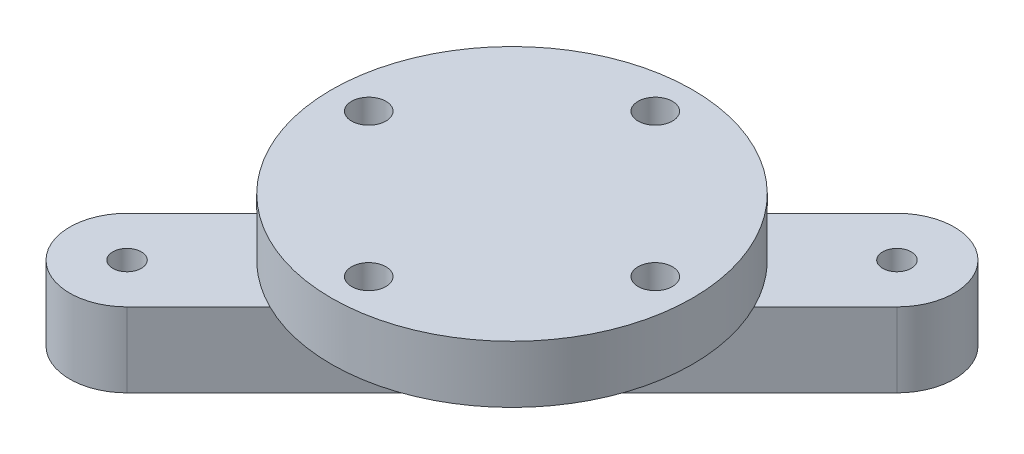
ISO-10303-21;
HEADER;
FILE_DESCRIPTION(('STEP AP214'),'2;1');
FILE_NAME('part.step','',(''),(''),'','','');
FILE_SCHEMA(('AUTOMOTIVE_DESIGN { 1 0 10303 214 1 1 1 1 }'));
ENDSEC;
DATA;
#1=APPLICATION_CONTEXT('core data for automotive mechanical design processes');
#2=APPLICATION_PROTOCOL_DEFINITION('international standard','automotive_design',2000,#1);
#3=PRODUCT_CONTEXT('',#1,'mechanical');
#4=PRODUCT('Part','Part','',(#3));
#5=PRODUCT_RELATED_PRODUCT_CATEGORY('part','',(#4));
#6=PRODUCT_DEFINITION_FORMATION('','',#4);
#7=PRODUCT_DEFINITION_CONTEXT('part definition',#1,'design');
#8=PRODUCT_DEFINITION('design','',#6,#7);
#9=PRODUCT_DEFINITION_SHAPE('','',#8);
#10=(LENGTH_UNIT() NAMED_UNIT(*) SI_UNIT(.MILLI.,.METRE.));
#11=(NAMED_UNIT(*) PLANE_ANGLE_UNIT() SI_UNIT($,.RADIAN.));
#12=(NAMED_UNIT(*) SI_UNIT($,.STERADIAN.) SOLID_ANGLE_UNIT());
#13=UNCERTAINTY_MEASURE_WITH_UNIT(LENGTH_MEASURE(1.E-05),#10,'distance_accuracy_value','');
#14=(GEOMETRIC_REPRESENTATION_CONTEXT(3) GLOBAL_UNCERTAINTY_ASSIGNED_CONTEXT((#13)) GLOBAL_UNIT_ASSIGNED_CONTEXT((#10,
#11,#12)) REPRESENTATION_CONTEXT('',''));
#15=CARTESIAN_POINT('',(0.,0.,0.));
#16=DIRECTION('',(0.,0.,1.));
#17=DIRECTION('',(1.,0.,0.));
#18=AXIS2_PLACEMENT_3D('',#15,#16,#17);
#19=CARTESIAN_POINT('',(0.,0.,0.));
#20=DIRECTION('',(0.,1.,0.));
#21=DIRECTION('',(0.,0.,1.));
#22=AXIS2_PLACEMENT_3D('',#19,#20,#21);
#23=PLANE('',#22);
#24=CARTESIAN_POINT('',(0.,0.,25.));
#25=DIRECTION('',(0.,1.,0.));
#26=DIRECTION('',(0.,0.,1.));
#27=AXIS2_PLACEMENT_3D('',#24,#25,#26);
#28=CIRCLE('',#27,5.);
#29=CARTESIAN_POINT('',(0.,0.,30.));
#30=VERTEX_POINT('',#29);
#31=EDGE_CURVE('E176',#30,#30,#28,.T.);
#32=ORIENTED_EDGE('',*,*,#31,.T.);
#33=EDGE_LOOP('',(#32));
#34=FACE_BOUND('',#33,.T.);
#35=CARTESIAN_POINT('',(25.,0.,0.));
#36=DIRECTION('',(0.,1.,0.));
#37=DIRECTION('',(0.,0.,1.));
#38=AXIS2_PLACEMENT_3D('',#35,#36,#37);
#39=CIRCLE('',#38,5.);
#40=CARTESIAN_POINT('',(25.,0.,5.));
#41=VERTEX_POINT('',#40);
#42=EDGE_CURVE('E168',#41,#41,#39,.T.);
#43=ORIENTED_EDGE('',*,*,#42,.T.);
#44=EDGE_LOOP('',(#43));
#45=FACE_BOUND('',#44,.T.);
#46=CARTESIAN_POINT('',(0.,0.,0.));
#47=DIRECTION('',(0.,1.,0.));
#48=DIRECTION('',(0.,0.,1.));
#49=AXIS2_PLACEMENT_3D('',#46,#47,#48);
#50=CIRCLE('',#49,31.5);
#51=CARTESIAN_POINT('',(-14.0506035235189,0.,28.1927391472499));
#52=VERTEX_POINT('',#51);
#53=CARTESIAN_POINT('',(28.1927391472499,0.,-14.050603523519));
#54=VERTEX_POINT('',#53);
#55=EDGE_CURVE('E195',#52,#54,#50,.T.);
#56=ORIENTED_EDGE('',*,*,#55,.F.);
#57=DIRECTION('',(0.707106781186547,0.,-0.707106781186548));
#58=VECTOR('',#57,1.);
#59=CARTESIAN_POINT('',(-26.5165042944955,0.,40.6586399182265));
#60=LINE('',#59,#58);
#61=EDGE_CURVE('E11',#52,#54,#60,.T.);
#62=ORIENTED_EDGE('',*,*,#61,.T.);
#63=EDGE_LOOP('',(#56,#62));
#64=FACE_BOUND('',#63,.T.);
#65=ADVANCED_FACE('F45',(#34,#45,#64),#23,.F.);
#66=CARTESIAN_POINT('',(0.,10.,0.));
#67=DIRECTION('',(0.,-1.,0.));
#68=DIRECTION('',(0.,0.,-1.));
#69=AXIS2_PLACEMENT_3D('',#66,#67,#68);
#70=CYLINDRICAL_SURFACE('',#69,31.5);
#71=CARTESIAN_POINT('',(0.,10.,0.));
#72=DIRECTION('',(0.,1.,0.));
#73=DIRECTION('',(0.,0.,1.));
#74=AXIS2_PLACEMENT_3D('',#71,#72,#73);
#75=CIRCLE('',#74,31.5);
#76=CARTESIAN_POINT('',(0.,10.,31.5));
#77=VERTEX_POINT('',#76);
#78=EDGE_CURVE('E208',#77,#77,#75,.T.);
#79=ORIENTED_EDGE('',*,*,#78,.F.);
#80=EDGE_LOOP('',(#79));
#81=FACE_BOUND('',#80,.T.);
#82=CARTESIAN_POINT('',(14.0506035235189,0.,-28.1927391472499));
#83=VERTEX_POINT('',#82);
#84=EDGE_CURVE('E212',#54,#83,#50,.T.);
#85=ORIENTED_EDGE('',*,*,#84,.T.);
#86=CARTESIAN_POINT('',(-28.1927391472499,0.,14.0506035235189));
#87=VERTEX_POINT('',#86);
#88=EDGE_CURVE('E216',#83,#87,#50,.T.);
#89=ORIENTED_EDGE('',*,*,#88,.T.);
#90=EDGE_CURVE('E264',#87,#52,#50,.T.);
#91=ORIENTED_EDGE('',*,*,#90,.T.);
#92=ORIENTED_EDGE('',*,*,#55,.T.);
#93=EDGE_LOOP('',(#85,#89,#91,#92));
#94=FACE_BOUND('',#93,.T.);
#95=ADVANCED_FACE('F47',(#81,#94),#70,.T.);
#96=CARTESIAN_POINT('',(0.,10.,0.));
#97=DIRECTION('',(0.,1.,0.));
#98=DIRECTION('',(0.,0.,1.));
#99=AXIS2_PLACEMENT_3D('',#96,#97,#98);
#100=PLANE('',#99);
#101=CARTESIAN_POINT('',(0.,10.,-25.));
#102=DIRECTION('',(0.,1.,0.));
#103=DIRECTION('',(0.,0.,1.));
#104=AXIS2_PLACEMENT_3D('',#101,#102,#103);
#105=CIRCLE('',#104,3.);
#106=CARTESIAN_POINT('',(0.,10.,-22.));
#107=VERTEX_POINT('',#106);
#108=EDGE_CURVE('E191',#107,#107,#105,.T.);
#109=ORIENTED_EDGE('',*,*,#108,.F.);
#110=EDGE_LOOP('',(#109));
#111=FACE_BOUND('',#110,.T.);
#112=CARTESIAN_POINT('',(25.,10.,0.));
#113=DIRECTION('',(0.,1.,0.));
#114=DIRECTION('',(0.,0.,1.));
#115=AXIS2_PLACEMENT_3D('',#112,#113,#114);
#116=CIRCLE('',#115,3.);
#117=CARTESIAN_POINT('',(25.,10.,3.));
#118=VERTEX_POINT('',#117);
#119=EDGE_CURVE('E196',#118,#118,#116,.T.);
#120=ORIENTED_EDGE('',*,*,#119,.F.);
#121=EDGE_LOOP('',(#120));
#122=FACE_BOUND('',#121,.T.);
#123=CARTESIAN_POINT('',(0.,10.,25.));
#124=DIRECTION('',(0.,1.,0.));
#125=DIRECTION('',(0.,0.,1.));
#126=AXIS2_PLACEMENT_3D('',#123,#124,#125);
#127=CIRCLE('',#126,3.);
#128=CARTESIAN_POINT('',(0.,10.,28.));
#129=VERTEX_POINT('',#128);
#130=EDGE_CURVE('E200',#129,#129,#127,.T.);
#131=ORIENTED_EDGE('',*,*,#130,.F.);
#132=EDGE_LOOP('',(#131));
#133=FACE_BOUND('',#132,.T.);
#134=CARTESIAN_POINT('',(-25.,10.,0.));
#135=DIRECTION('',(0.,1.,0.));
#136=DIRECTION('',(0.,0.,1.));
#137=AXIS2_PLACEMENT_3D('',#134,#135,#136);
#138=CIRCLE('',#137,3.);
#139=CARTESIAN_POINT('',(-25.,10.,3.00000000000001));
#140=VERTEX_POINT('',#139);
#141=EDGE_CURVE('E204',#140,#140,#138,.T.);
#142=ORIENTED_EDGE('',*,*,#141,.F.);
#143=EDGE_LOOP('',(#142));
#144=FACE_BOUND('',#143,.T.);
#145=ORIENTED_EDGE('',*,*,#78,.T.);
#146=EDGE_LOOP('',(#145));
#147=FACE_BOUND('',#146,.T.);
#148=ADVANCED_FACE('F243',(#111,#122,#133,#144,#147),#100,.T.);
#149=CARTESIAN_POINT('',(0.,0.,-25.));
#150=DIRECTION('',(0.,1.,0.));
#151=DIRECTION('',(0.,0.,1.));
#152=AXIS2_PLACEMENT_3D('',#149,#150,#151);
#153=CIRCLE('',#152,5.);
#154=CARTESIAN_POINT('',(0.,0.,-20.));
#155=VERTEX_POINT('',#154);
#156=EDGE_CURVE('E164',#155,#155,#153,.T.);
#157=ORIENTED_EDGE('',*,*,#156,.T.);
#158=EDGE_LOOP('',(#157));
#159=FACE_BOUND('',#158,.T.);
#160=CARTESIAN_POINT('',(-25.,0.,0.));
#161=DIRECTION('',(0.,1.,0.));
#162=DIRECTION('',(0.,0.,1.));
#163=AXIS2_PLACEMENT_3D('',#160,#161,#162);
#164=CIRCLE('',#163,5.);
#165=CARTESIAN_POINT('',(-25.,0.,5.00000000000001));
#166=VERTEX_POINT('',#165);
#167=EDGE_CURVE('E184',#166,#166,#164,.T.);
#168=ORIENTED_EDGE('',*,*,#167,.T.);
#169=EDGE_LOOP('',(#168));
#170=FACE_BOUND('',#169,.T.);
#171=ORIENTED_EDGE('',*,*,#88,.F.);
#172=DIRECTION('',(-0.707106781186547,0.,0.707106781186548));
#173=VECTOR('',#172,1.);
#174=CARTESIAN_POINT('',(-40.6586399182265,0.,26.5165042944955));
#175=LINE('',#174,#173);
#176=EDGE_CURVE('E55',#83,#87,#175,.T.);
#177=ORIENTED_EDGE('',*,*,#176,.T.);
#178=EDGE_LOOP('',(#171,#177));
#179=FACE_BOUND('',#178,.T.);
#180=ADVANCED_FACE('F239',(#159,#170,#179),#23,.F.);
#181=CARTESIAN_POINT('',(-25.,10.,0.));
#182=DIRECTION('',(0.,-1.,0.));
#183=DIRECTION('',(0.,0.,-1.));
#184=AXIS2_PLACEMENT_3D('',#181,#182,#183);
#185=CYLINDRICAL_SURFACE('',#184,3.);
#186=CARTESIAN_POINT('',(-25.,5.,0.));
#187=DIRECTION('',(0.,1.,0.));
#188=DIRECTION('',(0.,0.,1.));
#189=AXIS2_PLACEMENT_3D('',#186,#187,#188);
#190=CIRCLE('',#189,3.);
#191=CARTESIAN_POINT('',(-25.,5.,3.00000000000001));
#192=VERTEX_POINT('',#191);
#193=EDGE_CURVE('E49',#192,#192,#190,.T.);
#194=ORIENTED_EDGE('',*,*,#193,.F.);
#195=EDGE_LOOP('',(#194));
#196=FACE_BOUND('',#195,.T.);
#197=ORIENTED_EDGE('',*,*,#141,.T.);
#198=EDGE_LOOP('',(#197));
#199=FACE_BOUND('',#198,.T.);
#200=ADVANCED_FACE('F235',(#196,#199),#185,.F.);
#201=CARTESIAN_POINT('',(0.,10.,25.));
#202=DIRECTION('',(0.,-1.,0.));
#203=DIRECTION('',(0.,0.,-1.));
#204=AXIS2_PLACEMENT_3D('',#201,#202,#203);
#205=CYLINDRICAL_SURFACE('',#204,3.);
#206=CARTESIAN_POINT('',(0.,5.,25.));
#207=DIRECTION('',(0.,1.,0.));
#208=DIRECTION('',(0.,0.,1.));
#209=AXIS2_PLACEMENT_3D('',#206,#207,#208);
#210=CIRCLE('',#209,3.);
#211=CARTESIAN_POINT('',(0.,5.,28.));
#212=VERTEX_POINT('',#211);
#213=EDGE_CURVE('E223',#212,#212,#210,.T.);
#214=ORIENTED_EDGE('',*,*,#213,.F.);
#215=EDGE_LOOP('',(#214));
#216=FACE_BOUND('',#215,.T.);
#217=ORIENTED_EDGE('',*,*,#130,.T.);
#218=EDGE_LOOP('',(#217));
#219=FACE_BOUND('',#218,.T.);
#220=ADVANCED_FACE('F238',(#216,#219),#205,.F.);
#221=CARTESIAN_POINT('',(25.,10.,0.));
#222=DIRECTION('',(0.,-1.,0.));
#223=DIRECTION('',(0.,0.,-1.));
#224=AXIS2_PLACEMENT_3D('',#221,#222,#223);
#225=CYLINDRICAL_SURFACE('',#224,3.);
#226=CARTESIAN_POINT('',(25.,5.,0.));
#227=DIRECTION('',(0.,1.,0.));
#228=DIRECTION('',(0.,0.,1.));
#229=AXIS2_PLACEMENT_3D('',#226,#227,#228);
#230=CIRCLE('',#229,3.);
#231=CARTESIAN_POINT('',(25.,5.,3.));
#232=VERTEX_POINT('',#231);
#233=EDGE_CURVE('E220',#232,#232,#230,.T.);
#234=ORIENTED_EDGE('',*,*,#233,.F.);
#235=EDGE_LOOP('',(#234));
#236=FACE_BOUND('',#235,.T.);
#237=ORIENTED_EDGE('',*,*,#119,.T.);
#238=EDGE_LOOP('',(#237));
#239=FACE_BOUND('',#238,.T.);
#240=ADVANCED_FACE('F315',(#236,#239),#225,.F.);
#241=CARTESIAN_POINT('',(0.,10.,-25.));
#242=DIRECTION('',(0.,-1.,0.));
#243=DIRECTION('',(0.,0.,-1.));
#244=AXIS2_PLACEMENT_3D('',#241,#242,#243);
#245=CYLINDRICAL_SURFACE('',#244,3.);
#246=CARTESIAN_POINT('',(0.,5.,-25.));
#247=DIRECTION('',(0.,1.,0.));
#248=DIRECTION('',(0.,0.,1.));
#249=AXIS2_PLACEMENT_3D('',#246,#247,#248);
#250=CIRCLE('',#249,3.);
#251=CARTESIAN_POINT('',(0.,5.,-22.));
#252=VERTEX_POINT('',#251);
#253=EDGE_CURVE('E163',#252,#252,#250,.T.);
#254=ORIENTED_EDGE('',*,*,#253,.F.);
#255=EDGE_LOOP('',(#254));
#256=FACE_BOUND('',#255,.T.);
#257=ORIENTED_EDGE('',*,*,#108,.T.);
#258=EDGE_LOOP('',(#257));
#259=FACE_BOUND('',#258,.T.);
#260=ADVANCED_FACE('F311',(#256,#259),#245,.F.);
#261=CARTESIAN_POINT('',(0.,5.,-25.));
#262=DIRECTION('',(0.,-1.,0.));
#263=DIRECTION('',(0.,0.,-1.));
#264=AXIS2_PLACEMENT_3D('',#261,#262,#263);
#265=CYLINDRICAL_SURFACE('',#264,5.);
#266=CARTESIAN_POINT('',(0.,5.,-25.));
#267=DIRECTION('',(0.,1.,0.));
#268=DIRECTION('',(0.,0.,1.));
#269=AXIS2_PLACEMENT_3D('',#266,#267,#268);
#270=CIRCLE('',#269,5.);
#271=CARTESIAN_POINT('',(0.,5.,-20.));
#272=VERTEX_POINT('',#271);
#273=EDGE_CURVE('E159',#272,#272,#270,.T.);
#274=ORIENTED_EDGE('',*,*,#273,.T.);
#275=EDGE_LOOP('',(#274));
#276=FACE_BOUND('',#275,.T.);
#277=ORIENTED_EDGE('',*,*,#156,.F.);
#278=EDGE_LOOP('',(#277));
#279=FACE_BOUND('',#278,.T.);
#280=ADVANCED_FACE('F314',(#276,#279),#265,.F.);
#281=CARTESIAN_POINT('',(0.,5.,-25.));
#282=DIRECTION('',(0.,1.,0.));
#283=DIRECTION('',(0.,0.,1.));
#284=AXIS2_PLACEMENT_3D('',#281,#282,#283);
#285=PLANE('',#284);
#286=ORIENTED_EDGE('',*,*,#253,.T.);
#287=EDGE_LOOP('',(#286));
#288=FACE_BOUND('',#287,.T.);
#289=ORIENTED_EDGE('',*,*,#273,.F.);
#290=EDGE_LOOP('',(#289));
#291=FACE_BOUND('',#290,.T.);
#292=ADVANCED_FACE('F346',(#288,#291),#285,.F.);
#293=CARTESIAN_POINT('',(25.,5.,0.));
#294=DIRECTION('',(0.,-1.,0.));
#295=DIRECTION('',(0.,0.,-1.));
#296=AXIS2_PLACEMENT_3D('',#293,#294,#295);
#297=CYLINDRICAL_SURFACE('',#296,5.);
#298=CARTESIAN_POINT('',(25.,5.,0.));
#299=DIRECTION('',(0.,1.,0.));
#300=DIRECTION('',(0.,0.,1.));
#301=AXIS2_PLACEMENT_3D('',#298,#299,#300);
#302=CIRCLE('',#301,5.);
#303=CARTESIAN_POINT('',(25.,5.,5.));
#304=VERTEX_POINT('',#303);
#305=EDGE_CURVE('E172',#304,#304,#302,.T.);
#306=ORIENTED_EDGE('',*,*,#305,.T.);
#307=EDGE_LOOP('',(#306));
#308=FACE_BOUND('',#307,.T.);
#309=ORIENTED_EDGE('',*,*,#42,.F.);
#310=EDGE_LOOP('',(#309));
#311=FACE_BOUND('',#310,.T.);
#312=ADVANCED_FACE('F355',(#308,#311),#297,.F.);
#313=CARTESIAN_POINT('',(25.,5.,0.));
#314=DIRECTION('',(0.,1.,0.));
#315=DIRECTION('',(0.,0.,1.));
#316=AXIS2_PLACEMENT_3D('',#313,#314,#315);
#317=PLANE('',#316);
#318=ORIENTED_EDGE('',*,*,#233,.T.);
#319=EDGE_LOOP('',(#318));
#320=FACE_BOUND('',#319,.T.);
#321=ORIENTED_EDGE('',*,*,#305,.F.);
#322=EDGE_LOOP('',(#321));
#323=FACE_BOUND('',#322,.T.);
#324=ADVANCED_FACE('F364',(#320,#323),#317,.F.);
#325=CARTESIAN_POINT('',(0.,5.,25.));
#326=DIRECTION('',(0.,-1.,0.));
#327=DIRECTION('',(0.,0.,-1.));
#328=AXIS2_PLACEMENT_3D('',#325,#326,#327);
#329=CYLINDRICAL_SURFACE('',#328,5.);
#330=CARTESIAN_POINT('',(0.,5.,25.));
#331=DIRECTION('',(0.,1.,0.));
#332=DIRECTION('',(0.,0.,1.));
#333=AXIS2_PLACEMENT_3D('',#330,#331,#332);
#334=CIRCLE('',#333,5.);
#335=CARTESIAN_POINT('',(0.,5.,30.));
#336=VERTEX_POINT('',#335);
#337=EDGE_CURVE('E180',#336,#336,#334,.T.);
#338=ORIENTED_EDGE('',*,*,#337,.T.);
#339=EDGE_LOOP('',(#338));
#340=FACE_BOUND('',#339,.T.);
#341=ORIENTED_EDGE('',*,*,#31,.F.);
#342=EDGE_LOOP('',(#341));
#343=FACE_BOUND('',#342,.T.);
#344=ADVANCED_FACE('F307',(#340,#343),#329,.F.);
#345=CARTESIAN_POINT('',(0.,5.,25.));
#346=DIRECTION('',(0.,1.,0.));
#347=DIRECTION('',(0.,0.,1.));
#348=AXIS2_PLACEMENT_3D('',#345,#346,#347);
#349=PLANE('',#348);
#350=ORIENTED_EDGE('',*,*,#213,.T.);
#351=EDGE_LOOP('',(#350));
#352=FACE_BOUND('',#351,.T.);
#353=ORIENTED_EDGE('',*,*,#337,.F.);
#354=EDGE_LOOP('',(#353));
#355=FACE_BOUND('',#354,.T.);
#356=ADVANCED_FACE('F300',(#352,#355),#349,.F.);
#357=CARTESIAN_POINT('',(-25.,5.,0.));
#358=DIRECTION('',(0.,-1.,0.));
#359=DIRECTION('',(0.,0.,-1.));
#360=AXIS2_PLACEMENT_3D('',#357,#358,#359);
#361=CYLINDRICAL_SURFACE('',#360,5.);
#362=CARTESIAN_POINT('',(-25.,5.,0.));
#363=DIRECTION('',(0.,1.,0.));
#364=DIRECTION('',(0.,0.,1.));
#365=AXIS2_PLACEMENT_3D('',#362,#363,#364);
#366=CIRCLE('',#365,5.);
#367=CARTESIAN_POINT('',(-25.,5.,5.00000000000001));
#368=VERTEX_POINT('',#367);
#369=EDGE_CURVE('E153',#368,#368,#366,.T.);
#370=ORIENTED_EDGE('',*,*,#369,.T.);
#371=EDGE_LOOP('',(#370));
#372=FACE_BOUND('',#371,.T.);
#373=ORIENTED_EDGE('',*,*,#167,.F.);
#374=EDGE_LOOP('',(#373));
#375=FACE_BOUND('',#374,.T.);
#376=ADVANCED_FACE('F298',(#372,#375),#361,.F.);
#377=CARTESIAN_POINT('',(-25.,5.,0.));
#378=DIRECTION('',(0.,1.,0.));
#379=DIRECTION('',(0.,0.,1.));
#380=AXIS2_PLACEMENT_3D('',#377,#378,#379);
#381=PLANE('',#380);
#382=ORIENTED_EDGE('',*,*,#193,.T.);
#383=EDGE_LOOP('',(#382));
#384=FACE_BOUND('',#383,.T.);
#385=ORIENTED_EDGE('',*,*,#369,.F.);
#386=EDGE_LOOP('',(#385));
#387=FACE_BOUND('',#386,.T.);
#388=ADVANCED_FACE('F232',(#384,#387),#381,.F.);
#389=CARTESIAN_POINT('',(-33.587572106361,0.,33.587572106361));
#390=DIRECTION('',(0.,1.,0.));
#391=DIRECTION('',(0.,0.,1.));
#392=AXIS2_PLACEMENT_3D('',#389,#390,#391);
#393=PLANE('',#392);
#394=CARTESIAN_POINT('',(33.587572106361,0.,-33.587572106361));
#395=DIRECTION('',(0.,1.,0.));
#396=DIRECTION('',(0.,0.,1.));
#397=AXIS2_PLACEMENT_3D('',#394,#395,#396);
#398=CIRCLE('',#397,2.5);
#399=CARTESIAN_POINT('',(33.587572106361,0.,-31.087572106361));
#400=VERTEX_POINT('',#399);
#401=EDGE_CURVE('E135',#400,#400,#398,.T.);
#402=ORIENTED_EDGE('',*,*,#401,.F.);
#403=EDGE_LOOP('',(#402));
#404=FACE_BOUND('',#403,.T.);
#405=ORIENTED_EDGE('',*,*,#84,.F.);
#406=CARTESIAN_POINT('',(40.6586399182265,0.,-26.5165042944955));
#407=VERTEX_POINT('',#406);
#408=EDGE_CURVE('E58',#54,#407,#60,.T.);
#409=ORIENTED_EDGE('',*,*,#408,.T.);
#410=CARTESIAN_POINT('',(33.587572106361,0.,-33.587572106361));
#411=DIRECTION('',(0.,1.,0.));
#412=DIRECTION('',(0.,0.,1.));
#413=AXIS2_PLACEMENT_3D('',#410,#411,#412);
#414=CIRCLE('',#413,10.);
#415=CARTESIAN_POINT('',(26.5165042944955,0.,-40.6586399182265));
#416=VERTEX_POINT('',#415);
#417=EDGE_CURVE('E147',#407,#416,#414,.T.);
#418=ORIENTED_EDGE('',*,*,#417,.T.);
#419=EDGE_CURVE('E130',#416,#83,#175,.T.);
#420=ORIENTED_EDGE('',*,*,#419,.T.);
#421=EDGE_LOOP('',(#405,#409,#418,#420));
#422=FACE_BOUND('',#421,.T.);
#423=ADVANCED_FACE('F259',(#404,#422),#393,.T.);
#424=CARTESIAN_POINT('',(-33.587572106361,0.,33.587572106361));
#425=DIRECTION('',(0.,1.,0.));
#426=DIRECTION('',(0.,0.,1.));
#427=AXIS2_PLACEMENT_3D('',#424,#425,#426);
#428=CIRCLE('',#427,2.5);
#429=CARTESIAN_POINT('',(-33.587572106361,0.,36.087572106361));
#430=VERTEX_POINT('',#429);
#431=EDGE_CURVE('E479',#430,#430,#428,.T.);
#432=ORIENTED_EDGE('',*,*,#431,.F.);
#433=EDGE_LOOP('',(#432));
#434=FACE_BOUND('',#433,.T.);
#435=ORIENTED_EDGE('',*,*,#90,.F.);
#436=CARTESIAN_POINT('',(-40.6586399182265,0.,26.5165042944955));
#437=VERTEX_POINT('',#436);
#438=EDGE_CURVE('E65',#87,#437,#175,.T.);
#439=ORIENTED_EDGE('',*,*,#438,.T.);
#440=CARTESIAN_POINT('',(-33.587572106361,0.,33.587572106361));
#441=DIRECTION('',(0.,1.,0.));
#442=DIRECTION('',(0.,0.,1.));
#443=AXIS2_PLACEMENT_3D('',#440,#441,#442);
#444=CIRCLE('',#443,10.);
#445=CARTESIAN_POINT('',(-26.5165042944955,0.,40.6586399182265));
#446=VERTEX_POINT('',#445);
#447=EDGE_CURVE('E142',#437,#446,#444,.T.);
#448=ORIENTED_EDGE('',*,*,#447,.T.);
#449=EDGE_CURVE('E57',#446,#52,#60,.T.);
#450=ORIENTED_EDGE('',*,*,#449,.T.);
#451=EDGE_LOOP('',(#435,#439,#448,#450));
#452=FACE_BOUND('',#451,.T.);
#453=ADVANCED_FACE('F271',(#434,#452),#393,.T.);
#454=CARTESIAN_POINT('',(-33.587572106361,-13.,33.587572106361));
#455=DIRECTION('',(0.,1.,0.));
#456=DIRECTION('',(0.,0.,1.));
#457=AXIS2_PLACEMENT_3D('',#454,#455,#456);
#458=CYLINDRICAL_SURFACE('',#457,10.);
#459=ORIENTED_EDGE('',*,*,#447,.F.);
#460=DIRECTION('',(0.,1.,0.));
#461=VECTOR('',#460,1.);
#462=CARTESIAN_POINT('',(-40.6586399182265,-13.,26.5165042944955));
#463=LINE('',#462,#461);
#464=CARTESIAN_POINT('',(-40.6586399182265,-13.,26.5165042944955));
#465=VERTEX_POINT('',#464);
#466=EDGE_CURVE('E128',#465,#437,#463,.T.);
#467=ORIENTED_EDGE('',*,*,#466,.F.);
#468=CARTESIAN_POINT('',(-33.587572106361,-13.,33.587572106361));
#469=DIRECTION('',(0.,1.,0.));
#470=DIRECTION('',(0.,0.,1.));
#471=AXIS2_PLACEMENT_3D('',#468,#469,#470);
#472=CIRCLE('',#471,10.);
#473=CARTESIAN_POINT('',(-26.5165042944955,-13.,40.6586399182265));
#474=VERTEX_POINT('',#473);
#475=EDGE_CURVE('E121',#465,#474,#472,.T.);
#476=ORIENTED_EDGE('',*,*,#475,.T.);
#477=DIRECTION('',(0.,1.,0.));
#478=VECTOR('',#477,1.);
#479=CARTESIAN_POINT('',(-26.5165042944955,-13.,40.6586399182265));
#480=LINE('',#479,#478);
#481=EDGE_CURVE('E102',#474,#446,#480,.T.);
#482=ORIENTED_EDGE('',*,*,#481,.T.);
#483=EDGE_LOOP('',(#459,#467,#476,#482));
#484=FACE_BOUND('',#483,.T.);
#485=ADVANCED_FACE('F127',(#484),#458,.T.);
#486=CARTESIAN_POINT('',(-40.6586399182265,-13.,26.5165042944955));
#487=DIRECTION('',(-0.707106781186548,0.,-0.707106781186547));
#488=DIRECTION('',(-0.707106781186547,0.,0.707106781186548));
#489=AXIS2_PLACEMENT_3D('',#486,#487,#488);
#490=PLANE('',#489);
#491=ORIENTED_EDGE('',*,*,#419,.F.);
#492=DIRECTION('',(0.,1.,0.));
#493=VECTOR('',#492,1.);
#494=CARTESIAN_POINT('',(26.5165042944955,-13.,-40.6586399182265));
#495=LINE('',#494,#493);
#496=CARTESIAN_POINT('',(26.5165042944955,-13.,-40.6586399182265));
#497=VERTEX_POINT('',#496);
#498=EDGE_CURVE('E154',#497,#416,#495,.T.);
#499=ORIENTED_EDGE('',*,*,#498,.F.);
#500=DIRECTION('',(-0.707106781186547,0.,0.707106781186548));
#501=VECTOR('',#500,1.);
#502=CARTESIAN_POINT('',(-40.6586399182265,-13.,26.5165042944955));
#503=LINE('',#502,#501);
#504=EDGE_CURVE('E114',#497,#465,#503,.T.);
#505=ORIENTED_EDGE('',*,*,#504,.T.);
#506=ORIENTED_EDGE('',*,*,#466,.T.);
#507=ORIENTED_EDGE('',*,*,#438,.F.);
#508=ORIENTED_EDGE('',*,*,#176,.F.);
#509=EDGE_LOOP('',(#491,#499,#505,#506,#507,#508));
#510=FACE_BOUND('',#509,.T.);
#511=ADVANCED_FACE('F272',(#510),#490,.T.);
#512=CARTESIAN_POINT('',(33.587572106361,-13.,-33.587572106361));
#513=DIRECTION('',(0.,1.,0.));
#514=DIRECTION('',(0.,0.,1.));
#515=AXIS2_PLACEMENT_3D('',#512,#513,#514);
#516=CYLINDRICAL_SURFACE('',#515,10.);
#517=ORIENTED_EDGE('',*,*,#417,.F.);
#518=DIRECTION('',(0.,1.,0.));
#519=VECTOR('',#518,1.);
#520=CARTESIAN_POINT('',(40.6586399182265,-13.,-26.5165042944955));
#521=LINE('',#520,#519);
#522=CARTESIAN_POINT('',(40.6586399182265,-13.,-26.5165042944955));
#523=VERTEX_POINT('',#522);
#524=EDGE_CURVE('E113',#523,#407,#521,.T.);
#525=ORIENTED_EDGE('',*,*,#524,.F.);
#526=CARTESIAN_POINT('',(33.587572106361,-13.,-33.587572106361));
#527=DIRECTION('',(0.,1.,0.));
#528=DIRECTION('',(0.,0.,1.));
#529=AXIS2_PLACEMENT_3D('',#526,#527,#528);
#530=CIRCLE('',#529,10.);
#531=EDGE_CURVE('E124',#523,#497,#530,.T.);
#532=ORIENTED_EDGE('',*,*,#531,.T.);
#533=ORIENTED_EDGE('',*,*,#498,.T.);
#534=EDGE_LOOP('',(#517,#525,#532,#533));
#535=FACE_BOUND('',#534,.T.);
#536=ADVANCED_FACE('F274',(#535),#516,.T.);
#537=CARTESIAN_POINT('',(-26.5165042944955,-13.,40.6586399182265));
#538=DIRECTION('',(0.707106781186548,0.,0.707106781186547));
#539=DIRECTION('',(0.707106781186547,0.,-0.707106781186548));
#540=AXIS2_PLACEMENT_3D('',#537,#538,#539);
#541=PLANE('',#540);
#542=ORIENTED_EDGE('',*,*,#449,.F.);
#543=ORIENTED_EDGE('',*,*,#481,.F.);
#544=DIRECTION('',(0.707106781186547,0.,-0.707106781186548));
#545=VECTOR('',#544,1.);
#546=CARTESIAN_POINT('',(-26.5165042944955,-13.,40.6586399182265));
#547=LINE('',#546,#545);
#548=EDGE_CURVE('E106',#474,#523,#547,.T.);
#549=ORIENTED_EDGE('',*,*,#548,.T.);
#550=ORIENTED_EDGE('',*,*,#524,.T.);
#551=ORIENTED_EDGE('',*,*,#408,.F.);
#552=ORIENTED_EDGE('',*,*,#61,.F.);
#553=EDGE_LOOP('',(#542,#543,#549,#550,#551,#552));
#554=FACE_BOUND('',#553,.T.);
#555=ADVANCED_FACE('F104',(#554),#541,.T.);
#556=CARTESIAN_POINT('',(-33.587572106361,-13.,33.587572106361));
#557=DIRECTION('',(0.,1.,0.));
#558=DIRECTION('',(0.,0.,1.));
#559=AXIS2_PLACEMENT_3D('',#556,#557,#558);
#560=PLANE('',#559);
#561=CARTESIAN_POINT('',(-33.587572106361,-13.,33.587572106361));
#562=DIRECTION('',(0.,1.,0.));
#563=DIRECTION('',(0.,0.,1.));
#564=AXIS2_PLACEMENT_3D('',#561,#562,#563);
#565=CIRCLE('',#564,2.5);
#566=CARTESIAN_POINT('',(-33.587572106361,-13.,36.087572106361));
#567=VERTEX_POINT('',#566);
#568=EDGE_CURVE('E476',#567,#567,#565,.T.);
#569=ORIENTED_EDGE('',*,*,#568,.T.);
#570=EDGE_LOOP('',(#569));
#571=FACE_BOUND('',#570,.T.);
#572=CARTESIAN_POINT('',(33.587572106361,-13.,-33.587572106361));
#573=DIRECTION('',(0.,1.,0.));
#574=DIRECTION('',(0.,0.,1.));
#575=AXIS2_PLACEMENT_3D('',#572,#573,#574);
#576=CIRCLE('',#575,2.5);
#577=CARTESIAN_POINT('',(33.587572106361,-13.,-31.087572106361));
#578=VERTEX_POINT('',#577);
#579=EDGE_CURVE('E144',#578,#578,#576,.T.);
#580=ORIENTED_EDGE('',*,*,#579,.T.);
#581=EDGE_LOOP('',(#580));
#582=FACE_BOUND('',#581,.T.);
#583=ORIENTED_EDGE('',*,*,#475,.F.);
#584=ORIENTED_EDGE('',*,*,#504,.F.);
#585=ORIENTED_EDGE('',*,*,#531,.F.);
#586=ORIENTED_EDGE('',*,*,#548,.F.);
#587=EDGE_LOOP('',(#583,#584,#585,#586));
#588=FACE_BOUND('',#587,.T.);
#589=ADVANCED_FACE('F119',(#571,#582,#588),#560,.F.);
#590=CARTESIAN_POINT('',(33.587572106361,-13.,-33.587572106361));
#591=DIRECTION('',(0.,1.,0.));
#592=DIRECTION('',(0.,0.,1.));
#593=AXIS2_PLACEMENT_3D('',#590,#591,#592);
#594=CYLINDRICAL_SURFACE('',#593,2.5);
#595=CARTESIAN_POINT('',(33.587572106361,-13.,-31.087572106361));
#596=CARTESIAN_POINT('',(33.587572106361,-12.8645833333333,-31.087572106361));
#597=CARTESIAN_POINT('',(33.587572106361,-12.7291666666667,-31.087572106361));
#598=CARTESIAN_POINT('',(33.587572106361,-12.4583333333333,-31.087572106361));
#599=CARTESIAN_POINT('',(33.587572106361,-12.3229166666667,-31.087572106361));
#600=CARTESIAN_POINT('',(33.587572106361,-12.0520833333333,-31.087572106361));
#601=CARTESIAN_POINT('',(33.587572106361,-11.9166666666667,-31.087572106361));
#602=CARTESIAN_POINT('',(33.587572106361,-11.6458333333333,-31.087572106361));
#603=CARTESIAN_POINT('',(33.587572106361,-11.5104166666667,-31.087572106361));
#604=CARTESIAN_POINT('',(33.587572106361,-11.2395833333333,-31.087572106361));
#605=CARTESIAN_POINT('',(33.587572106361,-11.1041666666667,-31.087572106361));
#606=CARTESIAN_POINT('',(33.587572106361,-10.8333333333333,-31.087572106361));
#607=CARTESIAN_POINT('',(33.587572106361,-10.6979166666667,-31.087572106361));
#608=CARTESIAN_POINT('',(33.587572106361,-10.4270833333333,-31.087572106361));
#609=CARTESIAN_POINT('',(33.587572106361,-10.2916666666667,-31.087572106361));
#610=CARTESIAN_POINT('',(33.587572106361,-10.0208333333333,-31.087572106361));
#611=CARTESIAN_POINT('',(33.587572106361,-9.88541666666667,-31.087572106361));
#612=CARTESIAN_POINT('',(33.587572106361,-9.61458333333333,-31.087572106361));
#613=CARTESIAN_POINT('',(33.587572106361,-9.47916666666667,-31.087572106361));
#614=CARTESIAN_POINT('',(33.587572106361,-9.20833333333333,-31.087572106361));
#615=CARTESIAN_POINT('',(33.587572106361,-9.07291666666667,-31.087572106361));
#616=CARTESIAN_POINT('',(33.587572106361,-8.80208333333333,-31.087572106361));
#617=CARTESIAN_POINT('',(33.587572106361,-8.66666666666667,-31.087572106361));
#618=CARTESIAN_POINT('',(33.587572106361,-8.39583333333333,-31.087572106361));
#619=CARTESIAN_POINT('',(33.587572106361,-8.26041666666667,-31.087572106361));
#620=CARTESIAN_POINT('',(33.587572106361,-7.98958333333333,-31.087572106361));
#621=CARTESIAN_POINT('',(33.587572106361,-7.85416666666667,-31.087572106361));
#622=CARTESIAN_POINT('',(33.587572106361,-7.58333333333333,-31.087572106361));
#623=CARTESIAN_POINT('',(33.587572106361,-7.44791666666667,-31.087572106361));
#624=CARTESIAN_POINT('',(33.587572106361,-7.17708333333333,-31.087572106361));
#625=CARTESIAN_POINT('',(33.587572106361,-7.04166666666667,-31.087572106361));
#626=CARTESIAN_POINT('',(33.587572106361,-6.77083333333333,-31.087572106361));
#627=CARTESIAN_POINT('',(33.587572106361,-6.63541666666667,-31.087572106361));
#628=CARTESIAN_POINT('',(33.587572106361,-6.36458333333333,-31.087572106361));
#629=CARTESIAN_POINT('',(33.587572106361,-6.22916666666667,-31.087572106361));
#630=CARTESIAN_POINT('',(33.587572106361,-5.95833333333333,-31.087572106361));
#631=CARTESIAN_POINT('',(33.587572106361,-5.82291666666667,-31.087572106361));
#632=CARTESIAN_POINT('',(33.587572106361,-5.55208333333333,-31.087572106361));
#633=CARTESIAN_POINT('',(33.587572106361,-5.41666666666667,-31.087572106361));
#634=CARTESIAN_POINT('',(33.587572106361,-5.14583333333333,-31.087572106361));
#635=CARTESIAN_POINT('',(33.587572106361,-5.01041666666667,-31.087572106361));
#636=CARTESIAN_POINT('',(33.587572106361,-4.73958333333333,-31.087572106361));
#637=CARTESIAN_POINT('',(33.587572106361,-4.60416666666667,-31.087572106361));
#638=CARTESIAN_POINT('',(33.587572106361,-4.33333333333333,-31.087572106361));
#639=CARTESIAN_POINT('',(33.587572106361,-4.19791666666667,-31.087572106361));
#640=CARTESIAN_POINT('',(33.587572106361,-3.92708333333333,-31.087572106361));
#641=CARTESIAN_POINT('',(33.587572106361,-3.79166666666667,-31.087572106361));
#642=CARTESIAN_POINT('',(33.587572106361,-3.52083333333333,-31.087572106361));
#643=CARTESIAN_POINT('',(33.587572106361,-3.38541666666667,-31.087572106361));
#644=CARTESIAN_POINT('',(33.587572106361,-3.11458333333333,-31.087572106361));
#645=CARTESIAN_POINT('',(33.587572106361,-2.97916666666667,-31.087572106361));
#646=CARTESIAN_POINT('',(33.587572106361,-2.70833333333333,-31.087572106361));
#647=CARTESIAN_POINT('',(33.587572106361,-2.57291666666667,-31.087572106361));
#648=CARTESIAN_POINT('',(33.587572106361,-2.30208333333333,-31.087572106361));
#649=CARTESIAN_POINT('',(33.587572106361,-2.16666666666667,-31.087572106361));
#650=CARTESIAN_POINT('',(33.587572106361,-1.89583333333333,-31.087572106361));
#651=CARTESIAN_POINT('',(33.587572106361,-1.76041666666667,-31.087572106361));
#652=CARTESIAN_POINT('',(33.587572106361,-1.48958333333333,-31.087572106361));
#653=CARTESIAN_POINT('',(33.587572106361,-1.35416666666667,-31.087572106361));
#654=CARTESIAN_POINT('',(33.587572106361,-1.08333333333333,-31.087572106361));
#655=CARTESIAN_POINT('',(33.587572106361,-0.947916666666667,-31.087572106361));
#656=CARTESIAN_POINT('',(33.587572106361,-0.677083333333334,-31.087572106361));
#657=CARTESIAN_POINT('',(33.587572106361,-0.541666666666667,-31.087572106361));
#658=CARTESIAN_POINT('',(33.587572106361,-0.270833333333334,-31.087572106361));
#659=CARTESIAN_POINT('',(33.587572106361,-0.135416666666667,-31.087572106361));
#660=CARTESIAN_POINT('',(33.587572106361,0.,-31.087572106361));
#661=B_SPLINE_CURVE_WITH_KNOTS('',3,(#595,#596,#597,#598,#599,#600,#601,#602,#603,#604,#605,
#606,#607,#608,#609,#610,#611,#612,#613,#614,#615,#616,#617,#618,#619,#620,#621,#622,#623,#624,
#625,#626,#627,#628,#629,#630,#631,#632,#633,#634,#635,#636,#637,#638,#639,#640,#641,#642,#643,
#644,#645,#646,#647,#648,#649,#650,#651,#652,#653,#654,#655,#656,#657,#658,#659,#660),
.UNSPECIFIED.,.F.,.F.,(4,2,2,2,2,2,2,2,2,2,2,2,2,2,2,2,2,2,2,2,2,2,2,2,2,2,2,2,2,2,2,2,4),(0.,
0.406249999999999,0.812499999999999,1.21875,1.625,2.03125,2.4375,2.84375,3.25,3.65625,4.0625,
4.46875,4.875,5.28125,5.6875,6.09375,6.5,6.90625,7.3125,7.71875,8.125,8.53125,8.9375,9.34375,
9.75,10.15625,10.5625,10.96875,11.375,11.78125,12.1875,12.59375,13.),.UNSPECIFIED.);
#662=EDGE_CURVE('BSEAM450',#578,#400,#661,.T.);
#663=ORIENTED_EDGE('',*,*,#579,.F.);
#664=ORIENTED_EDGE('',*,*,#401,.T.);
#665=ORIENTED_EDGE('',*,*,#662,.T.);
#666=ORIENTED_EDGE('',*,*,#662,.F.);
#667=EDGE_LOOP('',(#663,#665,#664,#666));
#668=FACE_BOUND('',#667,.T.);
#669=ADVANCED_FACE('F450',(#668),#594,.F.);
#670=CARTESIAN_POINT('',(-33.587572106361,-13.,33.587572106361));
#671=DIRECTION('',(0.,1.,0.));
#672=DIRECTION('',(0.,0.,1.));
#673=AXIS2_PLACEMENT_3D('',#670,#671,#672);
#674=CYLINDRICAL_SURFACE('',#673,2.5);
#675=CARTESIAN_POINT('',(-33.587572106361,-13.,36.087572106361));
#676=CARTESIAN_POINT('',(-33.587572106361,-12.8645833333333,36.087572106361));
#677=CARTESIAN_POINT('',(-33.587572106361,-12.7291666666667,36.087572106361));
#678=CARTESIAN_POINT('',(-33.587572106361,-12.4583333333333,36.087572106361));
#679=CARTESIAN_POINT('',(-33.587572106361,-12.3229166666667,36.087572106361));
#680=CARTESIAN_POINT('',(-33.587572106361,-12.0520833333333,36.087572106361));
#681=CARTESIAN_POINT('',(-33.587572106361,-11.9166666666667,36.087572106361));
#682=CARTESIAN_POINT('',(-33.587572106361,-11.6458333333333,36.087572106361));
#683=CARTESIAN_POINT('',(-33.587572106361,-11.5104166666667,36.087572106361));
#684=CARTESIAN_POINT('',(-33.587572106361,-11.2395833333333,36.087572106361));
#685=CARTESIAN_POINT('',(-33.587572106361,-11.1041666666667,36.087572106361));
#686=CARTESIAN_POINT('',(-33.587572106361,-10.8333333333333,36.087572106361));
#687=CARTESIAN_POINT('',(-33.587572106361,-10.6979166666667,36.087572106361));
#688=CARTESIAN_POINT('',(-33.587572106361,-10.4270833333333,36.087572106361));
#689=CARTESIAN_POINT('',(-33.587572106361,-10.2916666666667,36.087572106361));
#690=CARTESIAN_POINT('',(-33.587572106361,-10.0208333333333,36.087572106361));
#691=CARTESIAN_POINT('',(-33.587572106361,-9.88541666666667,36.087572106361));
#692=CARTESIAN_POINT('',(-33.587572106361,-9.61458333333333,36.087572106361));
#693=CARTESIAN_POINT('',(-33.587572106361,-9.47916666666667,36.087572106361));
#694=CARTESIAN_POINT('',(-33.587572106361,-9.20833333333333,36.087572106361));
#695=CARTESIAN_POINT('',(-33.587572106361,-9.07291666666667,36.087572106361));
#696=CARTESIAN_POINT('',(-33.587572106361,-8.80208333333333,36.087572106361));
#697=CARTESIAN_POINT('',(-33.587572106361,-8.66666666666667,36.087572106361));
#698=CARTESIAN_POINT('',(-33.587572106361,-8.39583333333333,36.087572106361));
#699=CARTESIAN_POINT('',(-33.587572106361,-8.26041666666667,36.087572106361));
#700=CARTESIAN_POINT('',(-33.587572106361,-7.98958333333333,36.087572106361));
#701=CARTESIAN_POINT('',(-33.587572106361,-7.85416666666667,36.087572106361));
#702=CARTESIAN_POINT('',(-33.587572106361,-7.58333333333333,36.087572106361));
#703=CARTESIAN_POINT('',(-33.587572106361,-7.44791666666667,36.087572106361));
#704=CARTESIAN_POINT('',(-33.587572106361,-7.17708333333333,36.087572106361));
#705=CARTESIAN_POINT('',(-33.587572106361,-7.04166666666667,36.087572106361));
#706=CARTESIAN_POINT('',(-33.587572106361,-6.77083333333333,36.087572106361));
#707=CARTESIAN_POINT('',(-33.587572106361,-6.63541666666667,36.087572106361));
#708=CARTESIAN_POINT('',(-33.587572106361,-6.36458333333333,36.087572106361));
#709=CARTESIAN_POINT('',(-33.587572106361,-6.22916666666667,36.087572106361));
#710=CARTESIAN_POINT('',(-33.587572106361,-5.95833333333333,36.087572106361));
#711=CARTESIAN_POINT('',(-33.587572106361,-5.82291666666667,36.087572106361));
#712=CARTESIAN_POINT('',(-33.587572106361,-5.55208333333333,36.087572106361));
#713=CARTESIAN_POINT('',(-33.587572106361,-5.41666666666667,36.087572106361));
#714=CARTESIAN_POINT('',(-33.587572106361,-5.14583333333333,36.087572106361));
#715=CARTESIAN_POINT('',(-33.587572106361,-5.01041666666667,36.087572106361));
#716=CARTESIAN_POINT('',(-33.587572106361,-4.73958333333333,36.087572106361));
#717=CARTESIAN_POINT('',(-33.587572106361,-4.60416666666667,36.087572106361));
#718=CARTESIAN_POINT('',(-33.587572106361,-4.33333333333333,36.087572106361));
#719=CARTESIAN_POINT('',(-33.587572106361,-4.19791666666667,36.087572106361));
#720=CARTESIAN_POINT('',(-33.587572106361,-3.92708333333333,36.087572106361));
#721=CARTESIAN_POINT('',(-33.587572106361,-3.79166666666667,36.087572106361));
#722=CARTESIAN_POINT('',(-33.587572106361,-3.52083333333333,36.087572106361));
#723=CARTESIAN_POINT('',(-33.587572106361,-3.38541666666667,36.087572106361));
#724=CARTESIAN_POINT('',(-33.587572106361,-3.11458333333333,36.087572106361));
#725=CARTESIAN_POINT('',(-33.587572106361,-2.97916666666667,36.087572106361));
#726=CARTESIAN_POINT('',(-33.587572106361,-2.70833333333333,36.087572106361));
#727=CARTESIAN_POINT('',(-33.587572106361,-2.57291666666667,36.087572106361));
#728=CARTESIAN_POINT('',(-33.587572106361,-2.30208333333333,36.087572106361));
#729=CARTESIAN_POINT('',(-33.587572106361,-2.16666666666667,36.087572106361));
#730=CARTESIAN_POINT('',(-33.587572106361,-1.89583333333333,36.087572106361));
#731=CARTESIAN_POINT('',(-33.587572106361,-1.76041666666667,36.087572106361));
#732=CARTESIAN_POINT('',(-33.587572106361,-1.48958333333333,36.087572106361));
#733=CARTESIAN_POINT('',(-33.587572106361,-1.35416666666667,36.087572106361));
#734=CARTESIAN_POINT('',(-33.587572106361,-1.08333333333333,36.087572106361));
#735=CARTESIAN_POINT('',(-33.587572106361,-0.947916666666667,36.087572106361));
#736=CARTESIAN_POINT('',(-33.587572106361,-0.677083333333334,36.087572106361));
#737=CARTESIAN_POINT('',(-33.587572106361,-0.541666666666667,36.087572106361));
#738=CARTESIAN_POINT('',(-33.587572106361,-0.270833333333334,36.087572106361));
#739=CARTESIAN_POINT('',(-33.587572106361,-0.135416666666667,36.087572106361));
#740=CARTESIAN_POINT('',(-33.587572106361,0.,36.087572106361));
#741=B_SPLINE_CURVE_WITH_KNOTS('',3,(#675,#676,#677,#678,#679,#680,#681,#682,#683,#684,#685,
#686,#687,#688,#689,#690,#691,#692,#693,#694,#695,#696,#697,#698,#699,#700,#701,#702,#703,#704,
#705,#706,#707,#708,#709,#710,#711,#712,#713,#714,#715,#716,#717,#718,#719,#720,#721,#722,#723,
#724,#725,#726,#727,#728,#729,#730,#731,#732,#733,#734,#735,#736,#737,#738,#739,#740),
.UNSPECIFIED.,.F.,.F.,(4,2,2,2,2,2,2,2,2,2,2,2,2,2,2,2,2,2,2,2,2,2,2,2,2,2,2,2,2,2,2,2,4),(0.,
0.406249999999999,0.812499999999999,1.21875,1.625,2.03125,2.4375,2.84375,3.25,3.65625,4.0625,
4.46875,4.875,5.28125,5.6875,6.09375,6.5,6.90625,7.3125,7.71875,8.125,8.53125,8.9375,9.34375,
9.75,10.15625,10.5625,10.96875,11.375,11.78125,12.1875,12.59375,13.),.UNSPECIFIED.);
#742=EDGE_CURVE('BSEAM460',#567,#430,#741,.T.);
#743=ORIENTED_EDGE('',*,*,#568,.F.);
#744=ORIENTED_EDGE('',*,*,#431,.T.);
#745=ORIENTED_EDGE('',*,*,#742,.T.);
#746=ORIENTED_EDGE('',*,*,#742,.F.);
#747=EDGE_LOOP('',(#743,#745,#744,#746));
#748=FACE_BOUND('',#747,.T.);
#749=ADVANCED_FACE('F460',(#748),#674,.F.);
#750=CLOSED_SHELL('',(#65,#95,#148,#180,#200,#220,#240,#260,#280,#292,#312,#324,#344,#356,#376,
#388,#423,#453,#485,#511,#536,#555,#589,#669,#749));
#751=MANIFOLD_SOLID_BREP('B2',#750);
#752=ADVANCED_BREP_SHAPE_REPRESENTATION('',(#18,#751),#14);
#753=SHAPE_DEFINITION_REPRESENTATION(#9,#752);
ENDSEC;
END-ISO-10303-21;
